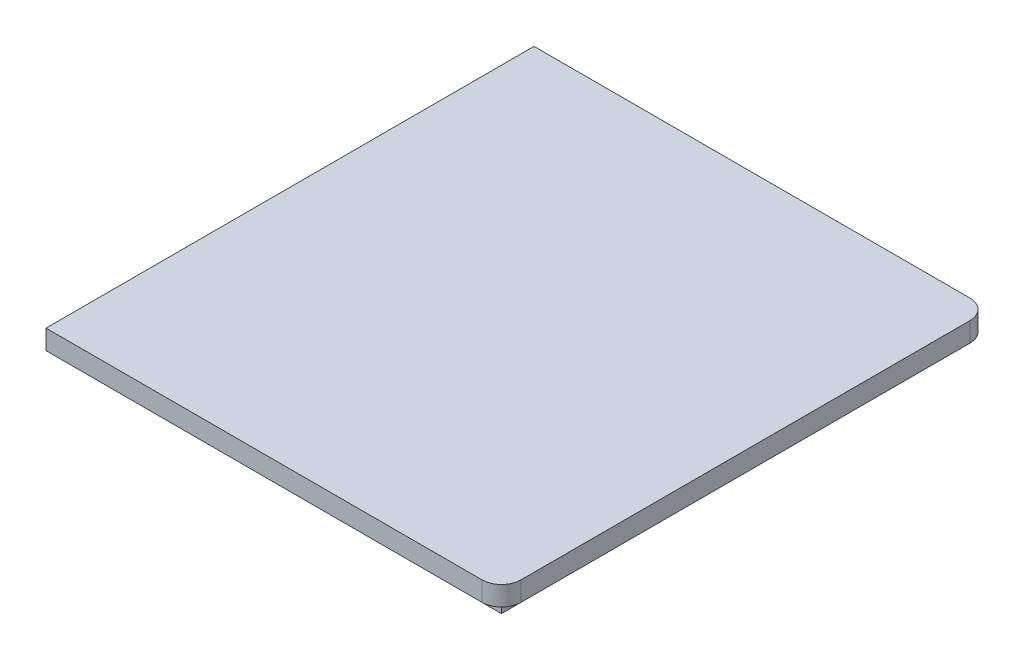
ISO-10303-21;
HEADER;
FILE_DESCRIPTION(('STEP AP214'),'2;1');
FILE_NAME('part.step','',(''),(''),'','','');
FILE_SCHEMA(('AUTOMOTIVE_DESIGN { 1 0 10303 214 1 1 1 1 }'));
ENDSEC;
DATA;
#1=APPLICATION_CONTEXT('core data for automotive mechanical design processes');
#2=APPLICATION_PROTOCOL_DEFINITION('international standard','automotive_design',2000,#1);
#3=PRODUCT_CONTEXT('',#1,'mechanical');
#4=PRODUCT('Part','Part','',(#3));
#5=PRODUCT_RELATED_PRODUCT_CATEGORY('part','',(#4));
#6=PRODUCT_DEFINITION_FORMATION('','',#4);
#7=PRODUCT_DEFINITION_CONTEXT('part definition',#1,'design');
#8=PRODUCT_DEFINITION('design','',#6,#7);
#9=PRODUCT_DEFINITION_SHAPE('','',#8);
#10=(LENGTH_UNIT() NAMED_UNIT(*) SI_UNIT(.MILLI.,.METRE.));
#11=(NAMED_UNIT(*) PLANE_ANGLE_UNIT() SI_UNIT($,.RADIAN.));
#12=(NAMED_UNIT(*) SI_UNIT($,.STERADIAN.) SOLID_ANGLE_UNIT());
#13=UNCERTAINTY_MEASURE_WITH_UNIT(LENGTH_MEASURE(1.E-05),#10,'distance_accuracy_value','');
#14=(GEOMETRIC_REPRESENTATION_CONTEXT(3) GLOBAL_UNCERTAINTY_ASSIGNED_CONTEXT((#13)) GLOBAL_UNIT_ASSIGNED_CONTEXT((#10,
#11,#12)) REPRESENTATION_CONTEXT('',''));
#15=CARTESIAN_POINT('',(0.,0.,0.));
#16=DIRECTION('',(0.,0.,1.));
#17=DIRECTION('',(1.,0.,0.));
#18=AXIS2_PLACEMENT_3D('',#15,#16,#17);
#19=CARTESIAN_POINT('',(-35.,3.,-37.5));
#20=DIRECTION('',(0.,0.,-1.));
#21=DIRECTION('',(-1.,0.,0.));
#22=AXIS2_PLACEMENT_3D('',#19,#20,#21);
#23=PLANE('',#22);
#24=DIRECTION('',(1.,0.,0.));
#25=VECTOR('',#24,1.);
#26=CARTESIAN_POINT('',(-35.,3.,-37.5));
#27=LINE('',#26,#25);
#28=CARTESIAN_POINT('',(-35.,3.,-37.5));
#29=VERTEX_POINT('',#28);
#30=CARTESIAN_POINT('',(32.,3.,-37.5));
#31=VERTEX_POINT('',#30);
#32=EDGE_CURVE('E166',#29,#31,#27,.T.);
#33=ORIENTED_EDGE('',*,*,#32,.T.);
#34=DIRECTION('',(0.,-1.,0.));
#35=VECTOR('',#34,1.);
#36=CARTESIAN_POINT('',(32.,3.,-37.5));
#37=LINE('',#36,#35);
#38=CARTESIAN_POINT('',(32.,0.,-37.5));
#39=VERTEX_POINT('',#38);
#40=EDGE_CURVE('E11',#31,#39,#37,.T.);
#41=ORIENTED_EDGE('',*,*,#40,.T.);
#42=DIRECTION('',(1.,0.,0.));
#43=VECTOR('',#42,1.);
#44=CARTESIAN_POINT('',(-35.,0.,-37.5));
#45=LINE('',#44,#43);
#46=CARTESIAN_POINT('',(-35.,0.,-37.5));
#47=VERTEX_POINT('',#46);
#48=EDGE_CURVE('E155',#47,#39,#45,.T.);
#49=ORIENTED_EDGE('',*,*,#48,.F.);
#50=DIRECTION('',(0.,-1.,0.));
#51=VECTOR('',#50,1.);
#52=CARTESIAN_POINT('',(-35.,3.,-37.5));
#53=LINE('',#52,#51);
#54=EDGE_CURVE('E189',#29,#47,#53,.T.);
#55=ORIENTED_EDGE('',*,*,#54,.F.);
#56=EDGE_LOOP('',(#33,#41,#49,#55));
#57=FACE_BOUND('',#56,.T.);
#58=ADVANCED_FACE('F45',(#57),#23,.T.);
#59=CARTESIAN_POINT('',(-35.,3.,-37.5));
#60=DIRECTION('',(1.,0.,0.));
#61=DIRECTION('',(0.,0.,-1.));
#62=AXIS2_PLACEMENT_3D('',#59,#60,#61);
#63=PLANE('',#62);
#64=DIRECTION('',(0.,0.,1.));
#65=VECTOR('',#64,1.);
#66=CARTESIAN_POINT('',(-35.,0.,-37.5));
#67=LINE('',#66,#65);
#68=CARTESIAN_POINT('',(-35.,0.,37.5));
#69=VERTEX_POINT('',#68);
#70=EDGE_CURVE('E170',#47,#69,#67,.T.);
#71=ORIENTED_EDGE('',*,*,#70,.T.);
#72=DIRECTION('',(0.,-1.,0.));
#73=VECTOR('',#72,1.);
#74=CARTESIAN_POINT('',(-35.,3.,37.5));
#75=LINE('',#74,#73);
#76=CARTESIAN_POINT('',(-35.,3.,37.5));
#77=VERTEX_POINT('',#76);
#78=EDGE_CURVE('E179',#77,#69,#75,.T.);
#79=ORIENTED_EDGE('',*,*,#78,.F.);
#80=DIRECTION('',(0.,0.,1.));
#81=VECTOR('',#80,1.);
#82=CARTESIAN_POINT('',(-35.,3.,-37.5));
#83=LINE('',#82,#81);
#84=EDGE_CURVE('E177',#29,#77,#83,.T.);
#85=ORIENTED_EDGE('',*,*,#84,.F.);
#86=ORIENTED_EDGE('',*,*,#54,.T.);
#87=EDGE_LOOP('',(#71,#79,#85,#86));
#88=FACE_BOUND('',#87,.T.);
#89=ADVANCED_FACE('F229',(#88),#63,.F.);
#90=CARTESIAN_POINT('',(-35.,3.,37.5));
#91=DIRECTION('',(0.,0.,-1.));
#92=DIRECTION('',(-1.,0.,0.));
#93=AXIS2_PLACEMENT_3D('',#90,#91,#92);
#94=PLANE('',#93);
#95=DIRECTION('',(1.,0.,0.));
#96=VECTOR('',#95,1.);
#97=CARTESIAN_POINT('',(-35.,0.,37.5));
#98=LINE('',#97,#96);
#99=CARTESIAN_POINT('',(32.,0.,37.5));
#100=VERTEX_POINT('',#99);
#101=EDGE_CURVE('E184',#69,#100,#98,.T.);
#102=ORIENTED_EDGE('',*,*,#101,.T.);
#103=DIRECTION('',(0.,-1.,0.));
#104=VECTOR('',#103,1.);
#105=CARTESIAN_POINT('',(32.,3.,37.5));
#106=LINE('',#105,#104);
#107=CARTESIAN_POINT('',(32.,3.,37.5));
#108=VERTEX_POINT('',#107);
#109=EDGE_CURVE('E69',#100,#108,#106,.F.);
#110=ORIENTED_EDGE('',*,*,#109,.T.);
#111=DIRECTION('',(1.,0.,0.));
#112=VECTOR('',#111,1.);
#113=CARTESIAN_POINT('',(-35.,3.,37.5));
#114=LINE('',#113,#112);
#115=EDGE_CURVE('E174',#77,#108,#114,.T.);
#116=ORIENTED_EDGE('',*,*,#115,.F.);
#117=ORIENTED_EDGE('',*,*,#78,.T.);
#118=EDGE_LOOP('',(#102,#110,#116,#117));
#119=FACE_BOUND('',#118,.T.);
#120=ADVANCED_FACE('F225',(#119),#94,.F.);
#121=CARTESIAN_POINT('',(35.,3.,-37.5));
#122=DIRECTION('',(1.,0.,0.));
#123=DIRECTION('',(0.,0.,-1.));
#124=AXIS2_PLACEMENT_3D('',#121,#122,#123);
#125=PLANE('',#124);
#126=DIRECTION('',(0.,0.,1.));
#127=VECTOR('',#126,1.);
#128=CARTESIAN_POINT('',(35.,3.,-37.5));
#129=LINE('',#128,#127);
#130=CARTESIAN_POINT('',(35.,3.,-34.5));
#131=VERTEX_POINT('',#130);
#132=CARTESIAN_POINT('',(35.,3.,34.5));
#133=VERTEX_POINT('',#132);
#134=EDGE_CURVE('E169',#131,#133,#129,.T.);
#135=ORIENTED_EDGE('',*,*,#134,.T.);
#136=DIRECTION('',(0.,-1.,0.));
#137=VECTOR('',#136,1.);
#138=CARTESIAN_POINT('',(35.,0.,34.5));
#139=LINE('',#138,#137);
#140=CARTESIAN_POINT('',(35.,0.,34.5));
#141=VERTEX_POINT('',#140);
#142=EDGE_CURVE('E198',#133,#141,#139,.T.);
#143=ORIENTED_EDGE('',*,*,#142,.T.);
#144=DIRECTION('',(0.,0.,1.));
#145=VECTOR('',#144,1.);
#146=CARTESIAN_POINT('',(35.,0.,-37.5));
#147=LINE('',#146,#145);
#148=CARTESIAN_POINT('',(35.,0.,-34.5));
#149=VERTEX_POINT('',#148);
#150=EDGE_CURVE('E160',#149,#141,#147,.T.);
#151=ORIENTED_EDGE('',*,*,#150,.F.);
#152=DIRECTION('',(0.,-1.,0.));
#153=VECTOR('',#152,1.);
#154=CARTESIAN_POINT('',(35.,3.,-34.5));
#155=LINE('',#154,#153);
#156=EDGE_CURVE('E192',#149,#131,#155,.F.);
#157=ORIENTED_EDGE('',*,*,#156,.T.);
#158=EDGE_LOOP('',(#135,#143,#151,#157));
#159=FACE_BOUND('',#158,.T.);
#160=ADVANCED_FACE('F217',(#159),#125,.T.);
#161=CARTESIAN_POINT('',(0.,3.,0.));
#162=DIRECTION('',(0.,-1.,0.));
#163=DIRECTION('',(0.,0.,-1.));
#164=AXIS2_PLACEMENT_3D('',#161,#162,#163);
#165=PLANE('',#164);
#166=ORIENTED_EDGE('',*,*,#115,.T.);
#167=CARTESIAN_POINT('',(32.,3.,34.5));
#168=DIRECTION('',(0.,-1.,0.));
#169=DIRECTION('',(0.,0.,-1.));
#170=AXIS2_PLACEMENT_3D('',#167,#168,#169);
#171=CIRCLE('',#170,3.);
#172=EDGE_CURVE('E54',#108,#133,#171,.F.);
#173=ORIENTED_EDGE('',*,*,#172,.T.);
#174=ORIENTED_EDGE('',*,*,#134,.F.);
#175=CARTESIAN_POINT('',(32.,3.,-34.5));
#176=DIRECTION('',(0.,-1.,0.));
#177=DIRECTION('',(0.,0.,-1.));
#178=AXIS2_PLACEMENT_3D('',#175,#176,#177);
#179=CIRCLE('',#178,3.);
#180=EDGE_CURVE('E61',#131,#31,#179,.F.);
#181=ORIENTED_EDGE('',*,*,#180,.T.);
#182=ORIENTED_EDGE('',*,*,#32,.F.);
#183=ORIENTED_EDGE('',*,*,#84,.T.);
#184=EDGE_LOOP('',(#166,#173,#174,#181,#182,#183));
#185=FACE_BOUND('',#184,.T.);
#186=ADVANCED_FACE('F213',(#185),#165,.F.);
#187=CARTESIAN_POINT('',(0.,0.,0.));
#188=DIRECTION('',(0.,-1.,0.));
#189=DIRECTION('',(0.,0.,-1.));
#190=AXIS2_PLACEMENT_3D('',#187,#188,#189);
#191=PLANE('',#190);
#192=DIRECTION('',(0.,0.,1.));
#193=VECTOR('',#192,1.);
#194=CARTESIAN_POINT('',(32.,0.,-34.5));
#195=LINE('',#194,#193);
#196=CARTESIAN_POINT('',(32.,0.,-34.5));
#197=VERTEX_POINT('',#196);
#198=CARTESIAN_POINT('',(32.,0.,34.5));
#199=VERTEX_POINT('',#198);
#200=EDGE_CURVE('E153',#197,#199,#195,.T.);
#201=ORIENTED_EDGE('',*,*,#200,.F.);
#202=DIRECTION('',(1.,0.,0.));
#203=VECTOR('',#202,1.);
#204=CARTESIAN_POINT('',(-32.,0.,-34.5));
#205=LINE('',#204,#203);
#206=CARTESIAN_POINT('',(-32.,0.,-34.5));
#207=VERTEX_POINT('',#206);
#208=EDGE_CURVE('E150',#207,#197,#205,.T.);
#209=ORIENTED_EDGE('',*,*,#208,.F.);
#210=DIRECTION('',(0.,0.,-1.));
#211=VECTOR('',#210,1.);
#212=CARTESIAN_POINT('',(-32.,0.,34.5));
#213=LINE('',#212,#211);
#214=CARTESIAN_POINT('',(-32.,0.,34.5));
#215=VERTEX_POINT('',#214);
#216=EDGE_CURVE('E347',#215,#207,#213,.T.);
#217=ORIENTED_EDGE('',*,*,#216,.F.);
#218=DIRECTION('',(-1.,0.,0.));
#219=VECTOR('',#218,1.);
#220=CARTESIAN_POINT('',(32.,0.,34.5));
#221=LINE('',#220,#219);
#222=EDGE_CURVE('E357',#199,#215,#221,.T.);
#223=ORIENTED_EDGE('',*,*,#222,.F.);
#224=EDGE_LOOP('',(#201,#209,#217,#223));
#225=FACE_BOUND('',#224,.T.);
#226=ORIENTED_EDGE('',*,*,#150,.T.);
#227=CARTESIAN_POINT('',(32.,0.,34.5));
#228=DIRECTION('',(0.,-1.,0.));
#229=DIRECTION('',(0.,0.,-1.));
#230=AXIS2_PLACEMENT_3D('',#227,#228,#229);
#231=CIRCLE('',#230,3.);
#232=EDGE_CURVE('E205',#141,#100,#231,.T.);
#233=ORIENTED_EDGE('',*,*,#232,.T.);
#234=ORIENTED_EDGE('',*,*,#101,.F.);
#235=ORIENTED_EDGE('',*,*,#70,.F.);
#236=ORIENTED_EDGE('',*,*,#48,.T.);
#237=CARTESIAN_POINT('',(32.,0.,-34.5));
#238=DIRECTION('',(0.,-1.,0.));
#239=DIRECTION('',(0.,0.,-1.));
#240=AXIS2_PLACEMENT_3D('',#237,#238,#239);
#241=CIRCLE('',#240,3.);
#242=EDGE_CURVE('E202',#39,#149,#241,.T.);
#243=ORIENTED_EDGE('',*,*,#242,.T.);
#244=EDGE_LOOP('',(#226,#233,#234,#235,#236,#243));
#245=FACE_BOUND('',#244,.T.);
#246=ADVANCED_FACE('F223',(#225,#245),#191,.T.);
#247=CARTESIAN_POINT('',(32.,-3.,-34.5));
#248=DIRECTION('',(-1.,0.,0.));
#249=DIRECTION('',(0.,0.,1.));
#250=AXIS2_PLACEMENT_3D('',#247,#248,#249);
#251=PLANE('',#250);
#252=ORIENTED_EDGE('',*,*,#200,.T.);
#253=DIRECTION('',(0.,1.,0.));
#254=VECTOR('',#253,1.);
#255=CARTESIAN_POINT('',(32.,-3.,34.5));
#256=LINE('',#255,#254);
#257=CARTESIAN_POINT('',(32.,-3.,34.5));
#258=VERTEX_POINT('',#257);
#259=EDGE_CURVE('E132',#258,#199,#256,.T.);
#260=ORIENTED_EDGE('',*,*,#259,.F.);
#261=DIRECTION('',(0.,0.,1.));
#262=VECTOR('',#261,1.);
#263=CARTESIAN_POINT('',(32.,-3.,-34.5));
#264=LINE('',#263,#262);
#265=CARTESIAN_POINT('',(32.,-3.,-34.5));
#266=VERTEX_POINT('',#265);
#267=EDGE_CURVE('E140',#266,#258,#264,.T.);
#268=ORIENTED_EDGE('',*,*,#267,.F.);
#269=DIRECTION('',(0.,1.,0.));
#270=VECTOR('',#269,1.);
#271=CARTESIAN_POINT('',(32.,-3.,-34.5));
#272=LINE('',#271,#270);
#273=EDGE_CURVE('E343',#266,#197,#272,.T.);
#274=ORIENTED_EDGE('',*,*,#273,.T.);
#275=EDGE_LOOP('',(#252,#260,#268,#274));
#276=FACE_BOUND('',#275,.T.);
#277=ADVANCED_FACE('F152',(#276),#251,.F.);
#278=CARTESIAN_POINT('',(32.,-3.,34.5));
#279=DIRECTION('',(0.,0.,-1.));
#280=DIRECTION('',(-1.,0.,0.));
#281=AXIS2_PLACEMENT_3D('',#278,#279,#280);
#282=PLANE('',#281);
#283=ORIENTED_EDGE('',*,*,#222,.T.);
#284=DIRECTION('',(0.,1.,0.));
#285=VECTOR('',#284,1.);
#286=CARTESIAN_POINT('',(-32.,-3.,34.5));
#287=LINE('',#286,#285);
#288=CARTESIAN_POINT('',(-32.,-3.,34.5));
#289=VERTEX_POINT('',#288);
#290=EDGE_CURVE('E135',#289,#215,#287,.T.);
#291=ORIENTED_EDGE('',*,*,#290,.F.);
#292=DIRECTION('',(-1.,0.,0.));
#293=VECTOR('',#292,1.);
#294=CARTESIAN_POINT('',(32.,-3.,34.5));
#295=LINE('',#294,#293);
#296=EDGE_CURVE('E127',#258,#289,#295,.T.);
#297=ORIENTED_EDGE('',*,*,#296,.F.);
#298=ORIENTED_EDGE('',*,*,#259,.T.);
#299=EDGE_LOOP('',(#283,#291,#297,#298));
#300=FACE_BOUND('',#299,.T.);
#301=ADVANCED_FACE('F130',(#300),#282,.F.);
#302=CARTESIAN_POINT('',(-32.,-3.,34.5));
#303=DIRECTION('',(1.,0.,0.));
#304=DIRECTION('',(0.,0.,-1.));
#305=AXIS2_PLACEMENT_3D('',#302,#303,#304);
#306=PLANE('',#305);
#307=ORIENTED_EDGE('',*,*,#216,.T.);
#308=DIRECTION('',(0.,1.,0.));
#309=VECTOR('',#308,1.);
#310=CARTESIAN_POINT('',(-32.,-3.,-34.5));
#311=LINE('',#310,#309);
#312=CARTESIAN_POINT('',(-32.,-3.,-34.5));
#313=VERTEX_POINT('',#312);
#314=EDGE_CURVE('E162',#313,#207,#311,.T.);
#315=ORIENTED_EDGE('',*,*,#314,.F.);
#316=DIRECTION('',(0.,0.,-1.));
#317=VECTOR('',#316,1.);
#318=CARTESIAN_POINT('',(-32.,-3.,34.5));
#319=LINE('',#318,#317);
#320=EDGE_CURVE('E139',#289,#313,#319,.T.);
#321=ORIENTED_EDGE('',*,*,#320,.F.);
#322=ORIENTED_EDGE('',*,*,#290,.T.);
#323=EDGE_LOOP('',(#307,#315,#321,#322));
#324=FACE_BOUND('',#323,.T.);
#325=ADVANCED_FACE('F259',(#324),#306,.F.);
#326=CARTESIAN_POINT('',(-32.,-3.,-34.5));
#327=DIRECTION('',(0.,0.,1.));
#328=DIRECTION('',(1.,0.,0.));
#329=AXIS2_PLACEMENT_3D('',#326,#327,#328);
#330=PLANE('',#329);
#331=ORIENTED_EDGE('',*,*,#208,.T.);
#332=ORIENTED_EDGE('',*,*,#273,.F.);
#333=DIRECTION('',(1.,0.,0.));
#334=VECTOR('',#333,1.);
#335=CARTESIAN_POINT('',(-32.,-3.,-34.5));
#336=LINE('',#335,#334);
#337=EDGE_CURVE('E145',#313,#266,#336,.T.);
#338=ORIENTED_EDGE('',*,*,#337,.F.);
#339=ORIENTED_EDGE('',*,*,#314,.T.);
#340=EDGE_LOOP('',(#331,#332,#338,#339));
#341=FACE_BOUND('',#340,.T.);
#342=ADVANCED_FACE('F262',(#341),#330,.F.);
#343=CARTESIAN_POINT('',(0.,-3.,0.));
#344=DIRECTION('',(0.,-1.,0.));
#345=DIRECTION('',(0.,0.,-1.));
#346=AXIS2_PLACEMENT_3D('',#343,#344,#345);
#347=PLANE('',#346);
#348=ORIENTED_EDGE('',*,*,#267,.T.);
#349=ORIENTED_EDGE('',*,*,#296,.T.);
#350=ORIENTED_EDGE('',*,*,#320,.T.);
#351=ORIENTED_EDGE('',*,*,#337,.T.);
#352=EDGE_LOOP('',(#348,#349,#350,#351));
#353=FACE_BOUND('',#352,.T.);
#354=ADVANCED_FACE('F143',(#353),#347,.T.);
#355=CARTESIAN_POINT('',(32.,3.,34.5));
#356=DIRECTION('',(0.,1.,0.));
#357=DIRECTION('',(0.,0.,1.));
#358=AXIS2_PLACEMENT_3D('',#355,#356,#357);
#359=CYLINDRICAL_SURFACE('',#358,3.);
#360=ORIENTED_EDGE('',*,*,#172,.F.);
#361=ORIENTED_EDGE('',*,*,#109,.F.);
#362=ORIENTED_EDGE('',*,*,#232,.F.);
#363=ORIENTED_EDGE('',*,*,#142,.F.);
#364=EDGE_LOOP('',(#360,#361,#362,#363));
#365=FACE_BOUND('',#364,.T.);
#366=ADVANCED_FACE('F220',(#365),#359,.T.);
#367=CARTESIAN_POINT('',(32.,3.,-34.5));
#368=DIRECTION('',(0.,-1.,0.));
#369=DIRECTION('',(0.,0.,-1.));
#370=AXIS2_PLACEMENT_3D('',#367,#368,#369);
#371=CYLINDRICAL_SURFACE('',#370,3.);
#372=ORIENTED_EDGE('',*,*,#180,.F.);
#373=ORIENTED_EDGE('',*,*,#156,.F.);
#374=ORIENTED_EDGE('',*,*,#242,.F.);
#375=ORIENTED_EDGE('',*,*,#40,.F.);
#376=EDGE_LOOP('',(#372,#373,#374,#375));
#377=FACE_BOUND('',#376,.T.);
#378=ADVANCED_FACE('F47',(#377),#371,.T.);
#379=CLOSED_SHELL('',(#58,#89,#120,#160,#186,#246,#277,#301,#325,#342,#354,#366,#378));
#380=MANIFOLD_SOLID_BREP('B2',#379);
#381=ADVANCED_BREP_SHAPE_REPRESENTATION('',(#18,#380),#14);
#382=SHAPE_DEFINITION_REPRESENTATION(#9,#381);
ENDSEC;
END-ISO-10303-21;
